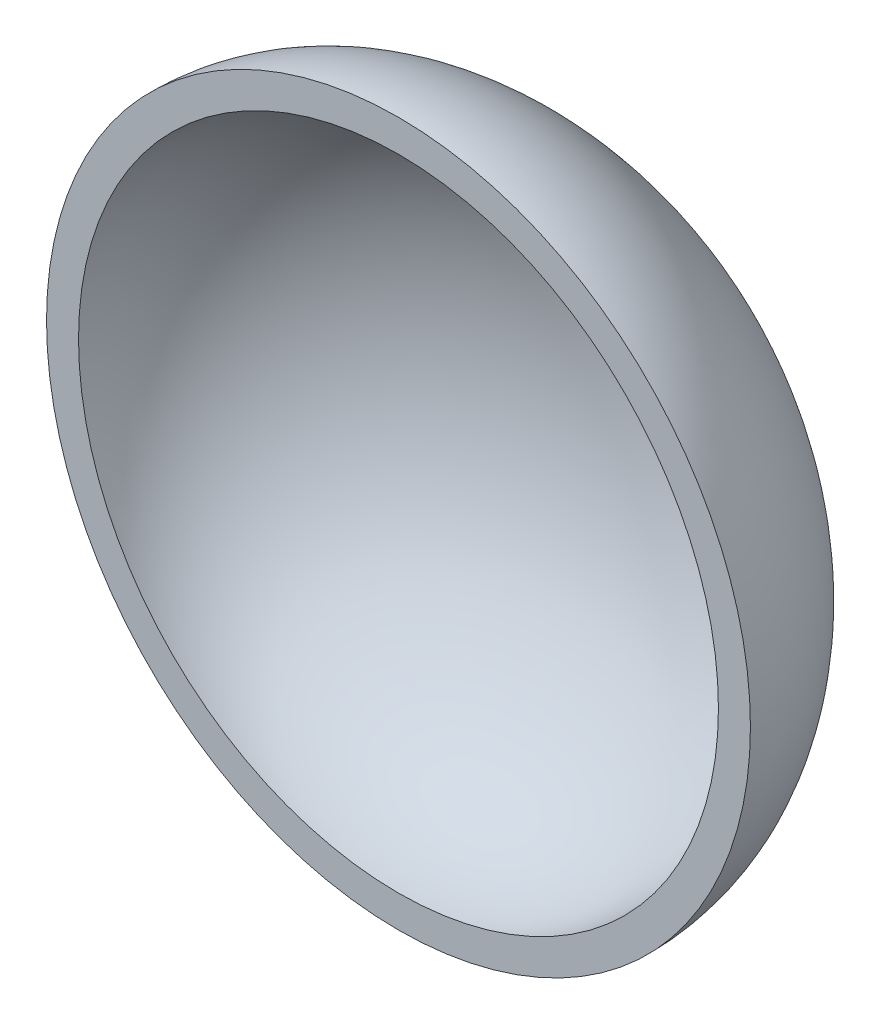
ISO-10303-21;
HEADER;
FILE_DESCRIPTION(('STEP AP214'),'2;1');
FILE_NAME('part.step','',(''),(''),'','','');
FILE_SCHEMA(('AUTOMOTIVE_DESIGN { 1 0 10303 214 1 1 1 1 }'));
ENDSEC;
DATA;
#1=APPLICATION_CONTEXT('core data for automotive mechanical design processes');
#2=APPLICATION_PROTOCOL_DEFINITION('international standard','automotive_design',2000,#1);
#3=PRODUCT_CONTEXT('',#1,'mechanical');
#4=PRODUCT('Part','Part','',(#3));
#5=PRODUCT_RELATED_PRODUCT_CATEGORY('part','',(#4));
#6=PRODUCT_DEFINITION_FORMATION('','',#4);
#7=PRODUCT_DEFINITION_CONTEXT('part definition',#1,'design');
#8=PRODUCT_DEFINITION('design','',#6,#7);
#9=PRODUCT_DEFINITION_SHAPE('','',#8);
#10=(LENGTH_UNIT() NAMED_UNIT(*) SI_UNIT(.MILLI.,.METRE.));
#11=(NAMED_UNIT(*) PLANE_ANGLE_UNIT() SI_UNIT($,.RADIAN.));
#12=(NAMED_UNIT(*) SI_UNIT($,.STERADIAN.) SOLID_ANGLE_UNIT());
#13=UNCERTAINTY_MEASURE_WITH_UNIT(LENGTH_MEASURE(1.E-05),#10,'distance_accuracy_value','');
#14=(GEOMETRIC_REPRESENTATION_CONTEXT(3) GLOBAL_UNCERTAINTY_ASSIGNED_CONTEXT((#13)) GLOBAL_UNIT_ASSIGNED_CONTEXT((#10,
#11,#12)) REPRESENTATION_CONTEXT('',''));
#15=CARTESIAN_POINT('',(0.,0.,0.));
#16=DIRECTION('',(0.,0.,1.));
#17=DIRECTION('',(1.,0.,0.));
#18=AXIS2_PLACEMENT_3D('',#15,#16,#17);
#19=CARTESIAN_POINT('',(0.,0.,0.));
#20=DIRECTION('',(0.,1.,0.));
#21=DIRECTION('',(1.,0.,0.));
#22=AXIS2_PLACEMENT_3D('',#19,#20,#21);
#23=ELLIPSE('',#22,22.,16.);
#24=TRIMMED_CURVE('',#23,(PARAMETER_VALUE(1.5707963267949)),(PARAMETER_VALUE(4.71238898038469)),
.T.,.PARAMETER.);
#25=CARTESIAN_POINT('',(0.,0.,-16.));
#26=DIRECTION('',(0.,0.,-1.));
#27=AXIS1_PLACEMENT('',#25,#26);
#28=SURFACE_OF_REVOLUTION('',#24,#27);
#29=CARTESIAN_POINT('',(0.,0.,0.));
#30=DIRECTION('',(0.,0.,-1.));
#31=DIRECTION('',(-1.,0.,0.));
#32=AXIS2_PLACEMENT_3D('',#29,#30,#31);
#33=CIRCLE('',#32,22.);
#34=CARTESIAN_POINT('',(-22.,0.,0.));
#35=VERTEX_POINT('',#34);
#36=EDGE_CURVE('E11',#35,#35,#33,.T.);
#37=ORIENTED_EDGE('',*,*,#36,.T.);
#38=EDGE_LOOP('',(#37));
#39=FACE_BOUND('',#38,.T.);
#40=CARTESIAN_POINT('',(0.,0.,-16.));
#41=VERTEX_POINT('',#40);
#42=VERTEX_LOOP('',#41);
#43=FACE_BOUND('',#42,.T.);
#44=ADVANCED_FACE('F41',(#39,#43),#28,.F.);
#45=CARTESIAN_POINT('',(-22.,0.,0.));
#46=DIRECTION('',(0.,0.,1.));
#47=DIRECTION('',(1.,0.,0.));
#48=AXIS2_PLACEMENT_3D('',#45,#46,#47);
#49=PLANE('',#48);
#50=CARTESIAN_POINT('',(0.,0.,0.));
#51=DIRECTION('',(0.,0.,-1.));
#52=DIRECTION('',(-1.,0.,0.));
#53=AXIS2_PLACEMENT_3D('',#50,#51,#52);
#54=CIRCLE('',#53,20.);
#55=CARTESIAN_POINT('',(-20.,0.,0.));
#56=VERTEX_POINT('',#55);
#57=EDGE_CURVE('E49',#56,#56,#54,.T.);
#58=ORIENTED_EDGE('',*,*,#57,.T.);
#59=EDGE_LOOP('',(#58));
#60=FACE_BOUND('',#59,.T.);
#61=ORIENTED_EDGE('',*,*,#36,.F.);
#62=EDGE_LOOP('',(#61));
#63=FACE_BOUND('',#62,.T.);
#64=ADVANCED_FACE('F58',(#60,#63),#49,.T.);
#65=CARTESIAN_POINT('',(0.,0.,0.));
#66=DIRECTION('',(0.,-1.,0.));
#67=DIRECTION('',(-1.,0.,0.));
#68=AXIS2_PLACEMENT_3D('',#65,#66,#67);
#69=ELLIPSE('',#68,20.,14.);
#70=TRIMMED_CURVE('',#69,(PARAMETER_VALUE(-1.5707963267949)),(PARAMETER_VALUE(1.5707963267949)),
.T.,.PARAMETER.);
#71=CARTESIAN_POINT('',(0.,0.,-16.));
#72=DIRECTION('',(0.,0.,-1.));
#73=AXIS1_PLACEMENT('',#71,#72);
#74=SURFACE_OF_REVOLUTION('',#70,#73);
#75=CARTESIAN_POINT('',(0.,0.,-14.));
#76=VERTEX_POINT('',#75);
#77=VERTEX_LOOP('',#76);
#78=FACE_BOUND('',#77,.T.);
#79=ORIENTED_EDGE('',*,*,#57,.F.);
#80=EDGE_LOOP('',(#79));
#81=FACE_BOUND('',#80,.T.);
#82=ADVANCED_FACE('F55',(#78,#81),#74,.F.);
#83=CLOSED_SHELL('',(#44,#64,#82));
#84=MANIFOLD_SOLID_BREP('B2',#83);
#85=ADVANCED_BREP_SHAPE_REPRESENTATION('',(#18,#84),#14);
#86=SHAPE_DEFINITION_REPRESENTATION(#9,#85);
ENDSEC;
END-ISO-10303-21;
